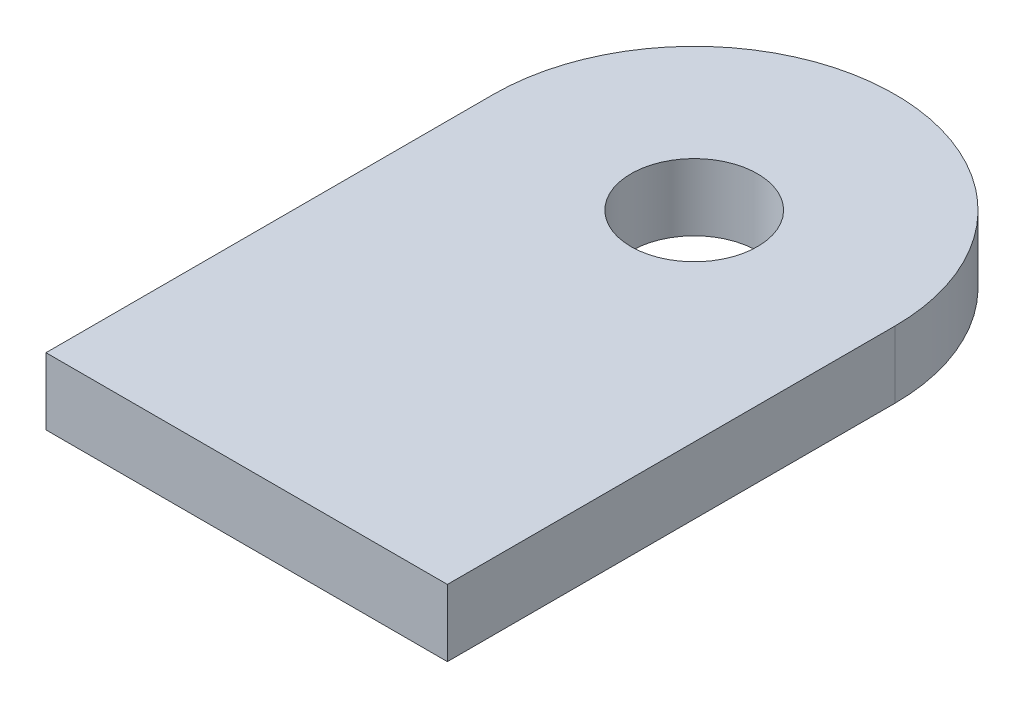
ISO-10303-21;
HEADER;
FILE_DESCRIPTION(('STEP AP214'),'2;1');
FILE_NAME('part.step','',(''),(''),'','','');
FILE_SCHEMA(('AUTOMOTIVE_DESIGN { 1 0 10303 214 1 1 1 1 }'));
ENDSEC;
DATA;
#1=APPLICATION_CONTEXT('core data for automotive mechanical design processes');
#2=APPLICATION_PROTOCOL_DEFINITION('international standard','automotive_design',2000,#1);
#3=PRODUCT_CONTEXT('',#1,'mechanical');
#4=PRODUCT('Part','Part','',(#3));
#5=PRODUCT_RELATED_PRODUCT_CATEGORY('part','',(#4));
#6=PRODUCT_DEFINITION_FORMATION('','',#4);
#7=PRODUCT_DEFINITION_CONTEXT('part definition',#1,'design');
#8=PRODUCT_DEFINITION('design','',#6,#7);
#9=PRODUCT_DEFINITION_SHAPE('','',#8);
#10=(LENGTH_UNIT() NAMED_UNIT(*) SI_UNIT(.MILLI.,.METRE.));
#11=(NAMED_UNIT(*) PLANE_ANGLE_UNIT() SI_UNIT($,.RADIAN.));
#12=(NAMED_UNIT(*) SI_UNIT($,.STERADIAN.) SOLID_ANGLE_UNIT());
#13=UNCERTAINTY_MEASURE_WITH_UNIT(LENGTH_MEASURE(1.E-05),#10,'distance_accuracy_value','');
#14=(GEOMETRIC_REPRESENTATION_CONTEXT(3) GLOBAL_UNCERTAINTY_ASSIGNED_CONTEXT((#13)) GLOBAL_UNIT_ASSIGNED_CONTEXT((#10,
#11,#12)) REPRESENTATION_CONTEXT('',''));
#15=CARTESIAN_POINT('',(0.,0.,0.));
#16=DIRECTION('',(0.,0.,1.));
#17=DIRECTION('',(1.,0.,0.));
#18=AXIS2_PLACEMENT_3D('',#15,#16,#17);
#19=CARTESIAN_POINT('',(0.,3.175,0.));
#20=DIRECTION('',(0.,-1.,0.));
#21=DIRECTION('',(0.,0.,-1.));
#22=AXIS2_PLACEMENT_3D('',#19,#20,#21);
#23=PLANE('',#22);
#24=DIRECTION('',(1.,0.,0.));
#25=VECTOR('',#24,1.);
#26=CARTESIAN_POINT('',(-9.525,3.175,21.24));
#27=LINE('',#26,#25);
#28=CARTESIAN_POINT('',(-9.525,3.175,21.24));
#29=VERTEX_POINT('',#28);
#30=CARTESIAN_POINT('',(9.525,3.175,21.24));
#31=VERTEX_POINT('',#30);
#32=EDGE_CURVE('E96',#29,#31,#27,.T.);
#33=ORIENTED_EDGE('',*,*,#32,.T.);
#34=DIRECTION('',(0.,0.,-1.));
#35=VECTOR('',#34,1.);
#36=CARTESIAN_POINT('',(9.525,3.175,0.));
#37=LINE('',#36,#35);
#38=CARTESIAN_POINT('',(9.525,3.175,0.));
#39=VERTEX_POINT('',#38);
#40=EDGE_CURVE('E91',#31,#39,#37,.T.);
#41=ORIENTED_EDGE('',*,*,#40,.T.);
#42=CARTESIAN_POINT('',(0.,3.175,0.));
#43=DIRECTION('',(0.,1.,0.));
#44=DIRECTION('',(0.,0.,-1.));
#45=AXIS2_PLACEMENT_3D('',#42,#43,#44);
#46=CIRCLE('',#45,9.525);
#47=CARTESIAN_POINT('',(-9.525,3.175,0.));
#48=VERTEX_POINT('',#47);
#49=EDGE_CURVE('E94',#39,#48,#46,.T.);
#50=ORIENTED_EDGE('',*,*,#49,.T.);
#51=DIRECTION('',(0.,0.,1.));
#52=VECTOR('',#51,1.);
#53=CARTESIAN_POINT('',(-9.525,3.175,0.));
#54=LINE('',#53,#52);
#55=EDGE_CURVE('E61',#48,#29,#54,.T.);
#56=ORIENTED_EDGE('',*,*,#55,.T.);
#57=EDGE_LOOP('',(#33,#41,#50,#56));
#58=FACE_BOUND('',#57,.T.);
#59=CARTESIAN_POINT('',(0.,3.175,0.));
#60=DIRECTION('',(0.,1.,0.));
#61=DIRECTION('',(0.,0.,1.));
#62=AXIS2_PLACEMENT_3D('',#59,#60,#61);
#63=CIRCLE('',#62,3.);
#64=CARTESIAN_POINT('',(0.,3.175,3.));
#65=VERTEX_POINT('',#64);
#66=EDGE_CURVE('E116',#65,#65,#63,.T.);
#67=ORIENTED_EDGE('',*,*,#66,.F.);
#68=EDGE_LOOP('',(#67));
#69=FACE_BOUND('',#68,.T.);
#70=ADVANCED_FACE('F43',(#58,#69),#23,.F.);
#71=CARTESIAN_POINT('',(0.,0.,0.));
#72=DIRECTION('',(0.,-1.,0.));
#73=DIRECTION('',(0.,0.,-1.));
#74=AXIS2_PLACEMENT_3D('',#71,#72,#73);
#75=PLANE('',#74);
#76=DIRECTION('',(1.,0.,0.));
#77=VECTOR('',#76,1.);
#78=CARTESIAN_POINT('',(-9.525,0.,21.24));
#79=LINE('',#78,#77);
#80=CARTESIAN_POINT('',(-9.525,0.,21.24));
#81=VERTEX_POINT('',#80);
#82=CARTESIAN_POINT('',(9.525,0.,21.24));
#83=VERTEX_POINT('',#82);
#84=EDGE_CURVE('E112',#81,#83,#79,.T.);
#85=ORIENTED_EDGE('',*,*,#84,.F.);
#86=DIRECTION('',(0.,0.,1.));
#87=VECTOR('',#86,1.);
#88=CARTESIAN_POINT('',(-9.525,0.,0.));
#89=LINE('',#88,#87);
#90=CARTESIAN_POINT('',(-9.525,0.,0.));
#91=VERTEX_POINT('',#90);
#92=EDGE_CURVE('E84',#91,#81,#89,.T.);
#93=ORIENTED_EDGE('',*,*,#92,.F.);
#94=CARTESIAN_POINT('',(0.,0.,0.));
#95=DIRECTION('',(0.,1.,0.));
#96=DIRECTION('',(0.,0.,-1.));
#97=AXIS2_PLACEMENT_3D('',#94,#95,#96);
#98=CIRCLE('',#97,9.525);
#99=CARTESIAN_POINT('',(9.525,0.,0.));
#100=VERTEX_POINT('',#99);
#101=EDGE_CURVE('E78',#100,#91,#98,.T.);
#102=ORIENTED_EDGE('',*,*,#101,.F.);
#103=DIRECTION('',(0.,0.,-1.));
#104=VECTOR('',#103,1.);
#105=CARTESIAN_POINT('',(9.525,0.,0.));
#106=LINE('',#105,#104);
#107=EDGE_CURVE('E101',#83,#100,#106,.T.);
#108=ORIENTED_EDGE('',*,*,#107,.F.);
#109=EDGE_LOOP('',(#85,#93,#102,#108));
#110=FACE_BOUND('',#109,.T.);
#111=CARTESIAN_POINT('',(0.,0.,0.));
#112=DIRECTION('',(0.,1.,0.));
#113=DIRECTION('',(0.,0.,1.));
#114=AXIS2_PLACEMENT_3D('',#111,#112,#113);
#115=CIRCLE('',#114,3.);
#116=CARTESIAN_POINT('',(0.,0.,3.));
#117=VERTEX_POINT('',#116);
#118=EDGE_CURVE('E134',#117,#117,#115,.T.);
#119=ORIENTED_EDGE('',*,*,#118,.T.);
#120=EDGE_LOOP('',(#119));
#121=FACE_BOUND('',#120,.T.);
#122=ADVANCED_FACE('F129',(#110,#121),#75,.T.);
#123=CARTESIAN_POINT('',(-9.525,3.175,21.24));
#124=DIRECTION('',(0.,0.,-1.));
#125=DIRECTION('',(-1.,0.,0.));
#126=AXIS2_PLACEMENT_3D('',#123,#124,#125);
#127=PLANE('',#126);
#128=ORIENTED_EDGE('',*,*,#84,.T.);
#129=DIRECTION('',(0.,-1.,0.));
#130=VECTOR('',#129,1.);
#131=CARTESIAN_POINT('',(9.525,3.175,21.24));
#132=LINE('',#131,#130);
#133=EDGE_CURVE('E11',#31,#83,#132,.T.);
#134=ORIENTED_EDGE('',*,*,#133,.F.);
#135=ORIENTED_EDGE('',*,*,#32,.F.);
#136=DIRECTION('',(0.,-1.,0.));
#137=VECTOR('',#136,1.);
#138=CARTESIAN_POINT('',(-9.525,3.175,21.24));
#139=LINE('',#138,#137);
#140=EDGE_CURVE('E108',#29,#81,#139,.T.);
#141=ORIENTED_EDGE('',*,*,#140,.T.);
#142=EDGE_LOOP('',(#128,#134,#135,#141));
#143=FACE_BOUND('',#142,.T.);
#144=ADVANCED_FACE('F45',(#143),#127,.F.);
#145=CARTESIAN_POINT('',(9.525,3.175,0.));
#146=DIRECTION('',(-1.,0.,0.));
#147=DIRECTION('',(0.,0.,1.));
#148=AXIS2_PLACEMENT_3D('',#145,#146,#147);
#149=PLANE('',#148);
#150=ORIENTED_EDGE('',*,*,#107,.T.);
#151=DIRECTION('',(0.,-1.,0.));
#152=VECTOR('',#151,1.);
#153=CARTESIAN_POINT('',(9.525,3.175,0.));
#154=LINE('',#153,#152);
#155=EDGE_CURVE('E53',#39,#100,#154,.T.);
#156=ORIENTED_EDGE('',*,*,#155,.F.);
#157=ORIENTED_EDGE('',*,*,#40,.F.);
#158=ORIENTED_EDGE('',*,*,#133,.T.);
#159=EDGE_LOOP('',(#150,#156,#157,#158));
#160=FACE_BOUND('',#159,.T.);
#161=ADVANCED_FACE('F100',(#160),#149,.F.);
#162=CARTESIAN_POINT('',(0.,3.175,0.));
#163=DIRECTION('',(0.,-1.,0.));
#164=DIRECTION('',(0.,0.,-1.));
#165=AXIS2_PLACEMENT_3D('',#162,#163,#164);
#166=CYLINDRICAL_SURFACE('',#165,9.525);
#167=ORIENTED_EDGE('',*,*,#101,.T.);
#168=DIRECTION('',(0.,-1.,0.));
#169=VECTOR('',#168,1.);
#170=CARTESIAN_POINT('',(-9.525,3.175,0.));
#171=LINE('',#170,#169);
#172=EDGE_CURVE('E103',#48,#91,#171,.T.);
#173=ORIENTED_EDGE('',*,*,#172,.F.);
#174=ORIENTED_EDGE('',*,*,#49,.F.);
#175=ORIENTED_EDGE('',*,*,#155,.T.);
#176=EDGE_LOOP('',(#167,#173,#174,#175));
#177=FACE_BOUND('',#176,.T.);
#178=ADVANCED_FACE('F104',(#177),#166,.T.);
#179=CARTESIAN_POINT('',(-9.525,3.175,0.));
#180=DIRECTION('',(1.,0.,0.));
#181=DIRECTION('',(0.,0.,-1.));
#182=AXIS2_PLACEMENT_3D('',#179,#180,#181);
#183=PLANE('',#182);
#184=ORIENTED_EDGE('',*,*,#92,.T.);
#185=ORIENTED_EDGE('',*,*,#140,.F.);
#186=ORIENTED_EDGE('',*,*,#55,.F.);
#187=ORIENTED_EDGE('',*,*,#172,.T.);
#188=EDGE_LOOP('',(#184,#185,#186,#187));
#189=FACE_BOUND('',#188,.T.);
#190=ADVANCED_FACE('F126',(#189),#183,.F.);
#191=CARTESIAN_POINT('',(0.,3.175,0.));
#192=DIRECTION('',(0.,-1.,0.));
#193=DIRECTION('',(0.,0.,-1.));
#194=AXIS2_PLACEMENT_3D('',#191,#192,#193);
#195=CYLINDRICAL_SURFACE('',#194,3.);
#196=ORIENTED_EDGE('',*,*,#66,.T.);
#197=EDGE_LOOP('',(#196));
#198=FACE_BOUND('',#197,.T.);
#199=ORIENTED_EDGE('',*,*,#118,.F.);
#200=EDGE_LOOP('',(#199));
#201=FACE_BOUND('',#200,.T.);
#202=ADVANCED_FACE('F142',(#198,#201),#195,.F.);
#203=CLOSED_SHELL('',(#70,#122,#144,#161,#178,#190,#202));
#204=MANIFOLD_SOLID_BREP('B2',#203);
#205=ADVANCED_BREP_SHAPE_REPRESENTATION('',(#18,#204),#14);
#206=SHAPE_DEFINITION_REPRESENTATION(#9,#205);
ENDSEC;
END-ISO-10303-21;
